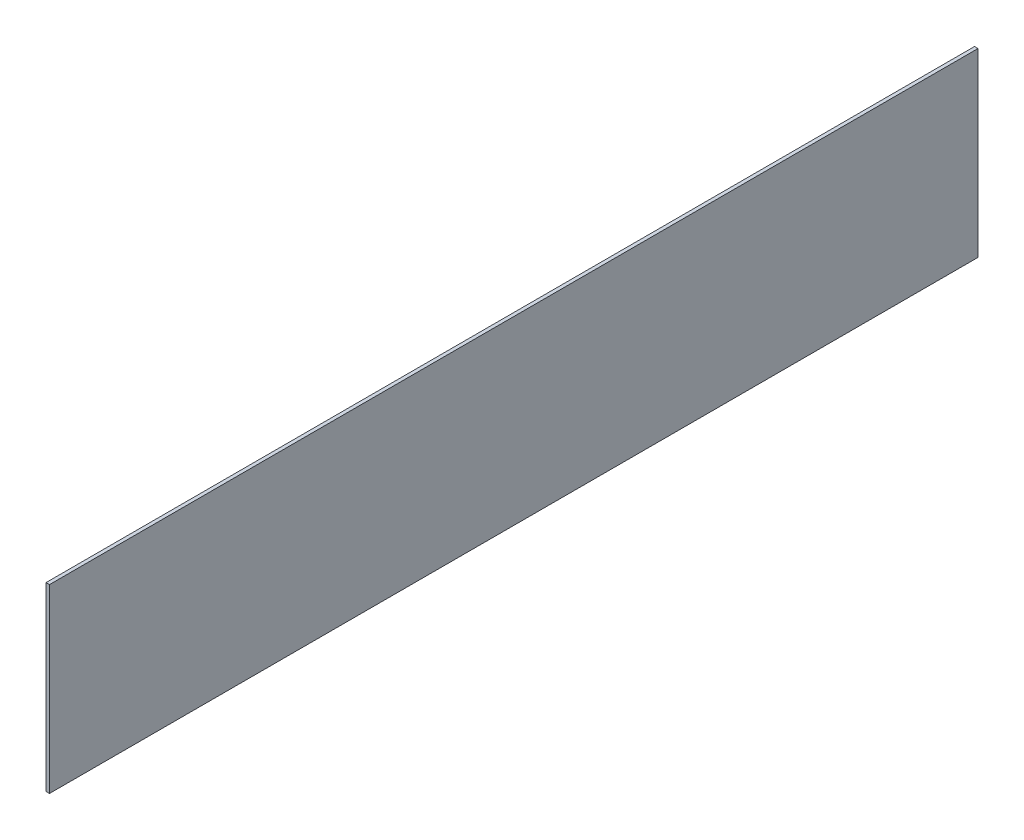
ISO-10303-21;
HEADER;
FILE_DESCRIPTION(('STEP AP214'),'2;1');
FILE_NAME('part.step','',(''),(''),'','','');
FILE_SCHEMA(('AUTOMOTIVE_DESIGN { 1 0 10303 214 1 1 1 1 }'));
ENDSEC;
DATA;
#1=APPLICATION_CONTEXT('core data for automotive mechanical design processes');
#2=APPLICATION_PROTOCOL_DEFINITION('international standard','automotive_design',2000,#1);
#3=PRODUCT_CONTEXT('',#1,'mechanical');
#4=PRODUCT('Part','Part','',(#3));
#5=PRODUCT_RELATED_PRODUCT_CATEGORY('part','',(#4));
#6=PRODUCT_DEFINITION_FORMATION('','',#4);
#7=PRODUCT_DEFINITION_CONTEXT('part definition',#1,'design');
#8=PRODUCT_DEFINITION('design','',#6,#7);
#9=PRODUCT_DEFINITION_SHAPE('','',#8);
#10=(LENGTH_UNIT() NAMED_UNIT(*) SI_UNIT(.MILLI.,.METRE.));
#11=(NAMED_UNIT(*) PLANE_ANGLE_UNIT() SI_UNIT($,.RADIAN.));
#12=(NAMED_UNIT(*) SI_UNIT($,.STERADIAN.) SOLID_ANGLE_UNIT());
#13=UNCERTAINTY_MEASURE_WITH_UNIT(LENGTH_MEASURE(1.E-05),#10,'distance_accuracy_value','');
#14=(GEOMETRIC_REPRESENTATION_CONTEXT(3) GLOBAL_UNCERTAINTY_ASSIGNED_CONTEXT((#13)) GLOBAL_UNIT_ASSIGNED_CONTEXT((#10,
#11,#12)) REPRESENTATION_CONTEXT('',''));
#15=CARTESIAN_POINT('',(0.,0.,0.));
#16=DIRECTION('',(0.,0.,1.));
#17=DIRECTION('',(1.,0.,0.));
#18=AXIS2_PLACEMENT_3D('',#15,#16,#17);
#19=CARTESIAN_POINT('',(30.,-779.028851114368,4007.98398588357));
#20=DIRECTION('',(0.,1.,0.));
#21=DIRECTION('',(0.,0.,1.));
#22=AXIS2_PLACEMENT_3D('',#19,#20,#21);
#23=PLANE('',#22);
#24=DIRECTION('',(0.,0.,-1.));
#25=VECTOR('',#24,1.);
#26=CARTESIAN_POINT('',(0.,-779.028851114368,4007.98398588357));
#27=LINE('',#26,#25);
#28=CARTESIAN_POINT('',(0.,-779.028851114368,4007.98398588357));
#29=VERTEX_POINT('',#28);
#30=CARTESIAN_POINT('',(0.,-779.028851114368,-3998.01601411643));
#31=VERTEX_POINT('',#30);
#32=EDGE_CURVE('E107',#29,#31,#27,.T.);
#33=ORIENTED_EDGE('',*,*,#32,.T.);
#34=DIRECTION('',(-1.,0.,0.));
#35=VECTOR('',#34,1.);
#36=CARTESIAN_POINT('',(30.,-779.028851114368,-3998.01601411643));
#37=LINE('',#36,#35);
#38=CARTESIAN_POINT('',(30.,-779.028851114368,-3998.01601411643));
#39=VERTEX_POINT('',#38);
#40=EDGE_CURVE('E11',#39,#31,#37,.T.);
#41=ORIENTED_EDGE('',*,*,#40,.F.);
#42=DIRECTION('',(0.,0.,-1.));
#43=VECTOR('',#42,1.);
#44=CARTESIAN_POINT('',(30.,-779.028851114368,4007.98398588357));
#45=LINE('',#44,#43);
#46=CARTESIAN_POINT('',(30.,-779.028851114368,4007.98398588357));
#47=VERTEX_POINT('',#46);
#48=EDGE_CURVE('E91',#47,#39,#45,.T.);
#49=ORIENTED_EDGE('',*,*,#48,.F.);
#50=DIRECTION('',(-1.,0.,0.));
#51=VECTOR('',#50,1.);
#52=CARTESIAN_POINT('',(30.,-779.028851114368,4007.98398588357));
#53=LINE('',#52,#51);
#54=EDGE_CURVE('E103',#47,#29,#53,.T.);
#55=ORIENTED_EDGE('',*,*,#54,.T.);
#56=EDGE_LOOP('',(#33,#41,#49,#55));
#57=FACE_BOUND('',#56,.T.);
#58=ADVANCED_FACE('F39',(#57),#23,.F.);
#59=CARTESIAN_POINT('',(30.,780.971148885632,-3998.01601411643));
#60=DIRECTION('',(0.,0.,1.));
#61=DIRECTION('',(1.,0.,0.));
#62=AXIS2_PLACEMENT_3D('',#59,#60,#61);
#63=PLANE('',#62);
#64=DIRECTION('',(0.,1.,0.));
#65=VECTOR('',#64,1.);
#66=CARTESIAN_POINT('',(0.,780.971148885632,-3998.01601411643));
#67=LINE('',#66,#65);
#68=CARTESIAN_POINT('',(0.,780.971148885632,-3998.01601411643));
#69=VERTEX_POINT('',#68);
#70=EDGE_CURVE('E96',#31,#69,#67,.T.);
#71=ORIENTED_EDGE('',*,*,#70,.T.);
#72=DIRECTION('',(-1.,0.,0.));
#73=VECTOR('',#72,1.);
#74=CARTESIAN_POINT('',(30.,780.971148885632,-3998.01601411643));
#75=LINE('',#74,#73);
#76=CARTESIAN_POINT('',(30.,780.971148885632,-3998.01601411643));
#77=VERTEX_POINT('',#76);
#78=EDGE_CURVE('E48',#77,#69,#75,.T.);
#79=ORIENTED_EDGE('',*,*,#78,.F.);
#80=DIRECTION('',(0.,1.,0.));
#81=VECTOR('',#80,1.);
#82=CARTESIAN_POINT('',(30.,780.971148885632,-3998.01601411643));
#83=LINE('',#82,#81);
#84=EDGE_CURVE('E86',#39,#77,#83,.T.);
#85=ORIENTED_EDGE('',*,*,#84,.F.);
#86=ORIENTED_EDGE('',*,*,#40,.T.);
#87=EDGE_LOOP('',(#71,#79,#85,#86));
#88=FACE_BOUND('',#87,.T.);
#89=ADVANCED_FACE('F95',(#88),#63,.F.);
#90=CARTESIAN_POINT('',(30.,780.971148885632,4007.98398588357));
#91=DIRECTION('',(0.,-1.,0.));
#92=DIRECTION('',(0.,0.,-1.));
#93=AXIS2_PLACEMENT_3D('',#90,#91,#92);
#94=PLANE('',#93);
#95=DIRECTION('',(0.,0.,1.));
#96=VECTOR('',#95,1.);
#97=CARTESIAN_POINT('',(0.,780.971148885632,4007.98398588357));
#98=LINE('',#97,#96);
#99=CARTESIAN_POINT('',(0.,780.971148885632,4007.98398588357));
#100=VERTEX_POINT('',#99);
#101=EDGE_CURVE('E73',#69,#100,#98,.T.);
#102=ORIENTED_EDGE('',*,*,#101,.T.);
#103=DIRECTION('',(-1.,0.,0.));
#104=VECTOR('',#103,1.);
#105=CARTESIAN_POINT('',(30.,780.971148885632,4007.98398588357));
#106=LINE('',#105,#104);
#107=CARTESIAN_POINT('',(30.,780.971148885632,4007.98398588357));
#108=VERTEX_POINT('',#107);
#109=EDGE_CURVE('E98',#108,#100,#106,.T.);
#110=ORIENTED_EDGE('',*,*,#109,.F.);
#111=DIRECTION('',(0.,0.,1.));
#112=VECTOR('',#111,1.);
#113=CARTESIAN_POINT('',(30.,780.971148885632,4007.98398588357));
#114=LINE('',#113,#112);
#115=EDGE_CURVE('E89',#77,#108,#114,.T.);
#116=ORIENTED_EDGE('',*,*,#115,.F.);
#117=ORIENTED_EDGE('',*,*,#78,.T.);
#118=EDGE_LOOP('',(#102,#110,#116,#117));
#119=FACE_BOUND('',#118,.T.);
#120=ADVANCED_FACE('F99',(#119),#94,.F.);
#121=CARTESIAN_POINT('',(30.,780.971148885632,4007.98398588357));
#122=DIRECTION('',(0.,0.,-1.));
#123=DIRECTION('',(-1.,0.,0.));
#124=AXIS2_PLACEMENT_3D('',#121,#122,#123);
#125=PLANE('',#124);
#126=DIRECTION('',(0.,-1.,0.));
#127=VECTOR('',#126,1.);
#128=CARTESIAN_POINT('',(0.,780.971148885632,4007.98398588357));
#129=LINE('',#128,#127);
#130=EDGE_CURVE('E79',#100,#29,#129,.T.);
#131=ORIENTED_EDGE('',*,*,#130,.T.);
#132=ORIENTED_EDGE('',*,*,#54,.F.);
#133=DIRECTION('',(0.,-1.,0.));
#134=VECTOR('',#133,1.);
#135=CARTESIAN_POINT('',(30.,780.971148885632,4007.98398588357));
#136=LINE('',#135,#134);
#137=EDGE_CURVE('E56',#108,#47,#136,.T.);
#138=ORIENTED_EDGE('',*,*,#137,.F.);
#139=ORIENTED_EDGE('',*,*,#109,.T.);
#140=EDGE_LOOP('',(#131,#132,#138,#139));
#141=FACE_BOUND('',#140,.T.);
#142=ADVANCED_FACE('F120',(#141),#125,.F.);
#143=CARTESIAN_POINT('',(30.,0.,0.));
#144=DIRECTION('',(-1.,0.,0.));
#145=DIRECTION('',(0.,0.,1.));
#146=AXIS2_PLACEMENT_3D('',#143,#144,#145);
#147=PLANE('',#146);
#148=ORIENTED_EDGE('',*,*,#48,.T.);
#149=ORIENTED_EDGE('',*,*,#84,.T.);
#150=ORIENTED_EDGE('',*,*,#115,.T.);
#151=ORIENTED_EDGE('',*,*,#137,.T.);
#152=EDGE_LOOP('',(#148,#149,#150,#151));
#153=FACE_BOUND('',#152,.T.);
#154=ADVANCED_FACE('F87',(#153),#147,.F.);
#155=CARTESIAN_POINT('',(0.,0.,0.));
#156=DIRECTION('',(-1.,0.,0.));
#157=DIRECTION('',(0.,0.,1.));
#158=AXIS2_PLACEMENT_3D('',#155,#156,#157);
#159=PLANE('',#158);
#160=ORIENTED_EDGE('',*,*,#32,.F.);
#161=ORIENTED_EDGE('',*,*,#130,.F.);
#162=ORIENTED_EDGE('',*,*,#101,.F.);
#163=ORIENTED_EDGE('',*,*,#70,.F.);
#164=EDGE_LOOP('',(#160,#161,#162,#163));
#165=FACE_BOUND('',#164,.T.);
#166=ADVANCED_FACE('F123',(#165),#159,.T.);
#167=CLOSED_SHELL('',(#58,#89,#120,#142,#154,#166));
#168=MANIFOLD_SOLID_BREP('B2',#167);
#169=ADVANCED_BREP_SHAPE_REPRESENTATION('',(#18,#168),#14);
#170=SHAPE_DEFINITION_REPRESENTATION(#9,#169);
ENDSEC;
END-ISO-10303-21;
